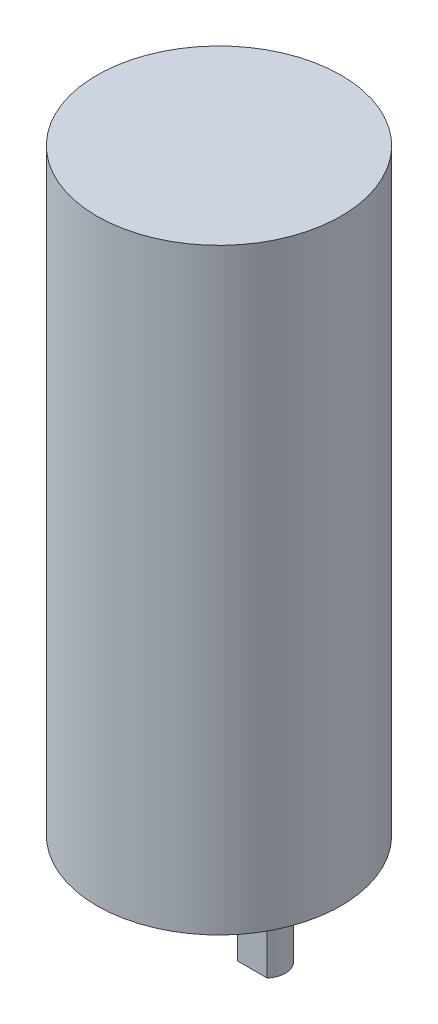
ISO-10303-21;
HEADER;
FILE_DESCRIPTION(('STEP AP214'),'2;1');
FILE_NAME('part.step','',(''),(''),'','','');
FILE_SCHEMA(('AUTOMOTIVE_DESIGN { 1 0 10303 214 1 1 1 1 }'));
ENDSEC;
DATA;
#1=APPLICATION_CONTEXT('core data for automotive mechanical design processes');
#2=APPLICATION_PROTOCOL_DEFINITION('international standard','automotive_design',2000,#1);
#3=PRODUCT_CONTEXT('',#1,'mechanical');
#4=PRODUCT('Part','Part','',(#3));
#5=PRODUCT_RELATED_PRODUCT_CATEGORY('part','',(#4));
#6=PRODUCT_DEFINITION_FORMATION('','',#4);
#7=PRODUCT_DEFINITION_CONTEXT('part definition',#1,'design');
#8=PRODUCT_DEFINITION('design','',#6,#7);
#9=PRODUCT_DEFINITION_SHAPE('','',#8);
#10=(LENGTH_UNIT() NAMED_UNIT(*) SI_UNIT(.MILLI.,.METRE.));
#11=(NAMED_UNIT(*) PLANE_ANGLE_UNIT() SI_UNIT($,.RADIAN.));
#12=(NAMED_UNIT(*) SI_UNIT($,.STERADIAN.) SOLID_ANGLE_UNIT());
#13=UNCERTAINTY_MEASURE_WITH_UNIT(LENGTH_MEASURE(1.E-05),#10,'distance_accuracy_value','');
#14=(GEOMETRIC_REPRESENTATION_CONTEXT(3) GLOBAL_UNCERTAINTY_ASSIGNED_CONTEXT((#13)) GLOBAL_UNIT_ASSIGNED_CONTEXT((#10,
#11,#12)) REPRESENTATION_CONTEXT('',''));
#15=CARTESIAN_POINT('',(0.,0.,0.));
#16=DIRECTION('',(0.,0.,1.));
#17=DIRECTION('',(1.,0.,0.));
#18=AXIS2_PLACEMENT_3D('',#15,#16,#17);
#19=CARTESIAN_POINT('',(0.,90.,0.));
#20=DIRECTION('',(0.,-1.,0.));
#21=DIRECTION('',(0.,0.,-1.));
#22=AXIS2_PLACEMENT_3D('',#19,#20,#21);
#23=CYLINDRICAL_SURFACE('',#22,18.4);
#24=CARTESIAN_POINT('',(0.,90.,0.));
#25=DIRECTION('',(0.,1.,0.));
#26=DIRECTION('',(0.,0.,1.));
#27=AXIS2_PLACEMENT_3D('',#24,#25,#26);
#28=CIRCLE('',#27,18.4);
#29=CARTESIAN_POINT('',(0.,90.,-18.4));
#30=VERTEX_POINT('',#29);
#31=EDGE_CURVE('E205',#30,#30,#28,.T.);
#32=CARTESIAN_POINT('',(0.,0.,0.));
#33=DIRECTION('',(0.,1.,0.));
#34=DIRECTION('',(0.,0.,1.));
#35=AXIS2_PLACEMENT_3D('',#32,#33,#34);
#36=CIRCLE('',#35,18.4);
#37=CARTESIAN_POINT('',(0.,0.,-18.4));
#38=VERTEX_POINT('',#37);
#39=EDGE_CURVE('E204',#38,#38,#36,.T.);
#40=CARTESIAN_POINT('',(0.,90.,-18.4));
#41=CARTESIAN_POINT('',(0.,89.0625,-18.4));
#42=CARTESIAN_POINT('',(0.,88.125,-18.4));
#43=CARTESIAN_POINT('',(0.,86.25,-18.4));
#44=CARTESIAN_POINT('',(0.,85.3125,-18.4));
#45=CARTESIAN_POINT('',(0.,83.4375,-18.4));
#46=CARTESIAN_POINT('',(0.,82.5,-18.4));
#47=CARTESIAN_POINT('',(0.,80.625,-18.4));
#48=CARTESIAN_POINT('',(0.,79.6875,-18.4));
#49=CARTESIAN_POINT('',(0.,77.8125,-18.4));
#50=CARTESIAN_POINT('',(0.,76.875,-18.4));
#51=CARTESIAN_POINT('',(0.,75.,-18.4));
#52=CARTESIAN_POINT('',(0.,74.0625,-18.4));
#53=CARTESIAN_POINT('',(0.,72.1875,-18.4));
#54=CARTESIAN_POINT('',(0.,71.25,-18.4));
#55=CARTESIAN_POINT('',(0.,69.375,-18.4));
#56=CARTESIAN_POINT('',(0.,68.4375,-18.4));
#57=CARTESIAN_POINT('',(0.,66.5625,-18.4));
#58=CARTESIAN_POINT('',(0.,65.625,-18.4));
#59=CARTESIAN_POINT('',(0.,63.75,-18.4));
#60=CARTESIAN_POINT('',(0.,62.8125,-18.4));
#61=CARTESIAN_POINT('',(0.,60.9375,-18.4));
#62=CARTESIAN_POINT('',(0.,60.,-18.4));
#63=CARTESIAN_POINT('',(0.,58.125,-18.4));
#64=CARTESIAN_POINT('',(0.,57.1875,-18.4));
#65=CARTESIAN_POINT('',(0.,55.3125,-18.4));
#66=CARTESIAN_POINT('',(0.,54.375,-18.4));
#67=CARTESIAN_POINT('',(0.,52.5,-18.4));
#68=CARTESIAN_POINT('',(0.,51.5625,-18.4));
#69=CARTESIAN_POINT('',(0.,49.6875,-18.4));
#70=CARTESIAN_POINT('',(0.,48.75,-18.4));
#71=CARTESIAN_POINT('',(0.,46.875,-18.4));
#72=CARTESIAN_POINT('',(0.,45.9375,-18.4));
#73=CARTESIAN_POINT('',(0.,44.0625,-18.4));
#74=CARTESIAN_POINT('',(0.,43.125,-18.4));
#75=CARTESIAN_POINT('',(0.,41.25,-18.4));
#76=CARTESIAN_POINT('',(0.,40.3125,-18.4));
#77=CARTESIAN_POINT('',(0.,38.4375,-18.4));
#78=CARTESIAN_POINT('',(0.,37.5,-18.4));
#79=CARTESIAN_POINT('',(0.,35.625,-18.4));
#80=CARTESIAN_POINT('',(0.,34.6875,-18.4));
#81=CARTESIAN_POINT('',(0.,32.8125,-18.4));
#82=CARTESIAN_POINT('',(0.,31.875,-18.4));
#83=CARTESIAN_POINT('',(0.,30.,-18.4));
#84=CARTESIAN_POINT('',(0.,29.0625,-18.4));
#85=CARTESIAN_POINT('',(0.,27.1875,-18.4));
#86=CARTESIAN_POINT('',(0.,26.25,-18.4));
#87=CARTESIAN_POINT('',(0.,24.375,-18.4));
#88=CARTESIAN_POINT('',(0.,23.4375,-18.4));
#89=CARTESIAN_POINT('',(0.,21.5625,-18.4));
#90=CARTESIAN_POINT('',(0.,20.625,-18.4));
#91=CARTESIAN_POINT('',(0.,18.75,-18.4));
#92=CARTESIAN_POINT('',(0.,17.8125,-18.4));
#93=CARTESIAN_POINT('',(0.,15.9375,-18.4));
#94=CARTESIAN_POINT('',(0.,15.,-18.4));
#95=CARTESIAN_POINT('',(0.,13.125,-18.4));
#96=CARTESIAN_POINT('',(0.,12.1875,-18.4));
#97=CARTESIAN_POINT('',(0.,10.3125,-18.4));
#98=CARTESIAN_POINT('',(0.,9.37499999999999,-18.4));
#99=CARTESIAN_POINT('',(0.,7.49999999999999,-18.4));
#100=CARTESIAN_POINT('',(0.,6.56249999999999,-18.4));
#101=CARTESIAN_POINT('',(0.,4.68749999999999,-18.4));
#102=CARTESIAN_POINT('',(0.,3.74999999999998,-18.4));
#103=CARTESIAN_POINT('',(0.,1.87499999999998,-18.4));
#104=CARTESIAN_POINT('',(0.,0.937499999999986,-18.4));
#105=CARTESIAN_POINT('',(0.,0.,-18.4));
#106=B_SPLINE_CURVE_WITH_KNOTS('',3,(#40,#41,#42,#43,#44,#45,#46,#47,#48,#49,#50,#51,#52,#53,
#54,#55,#56,#57,#58,#59,#60,#61,#62,#63,#64,#65,#66,#67,#68,#69,#70,#71,#72,#73,#74,#75,#76,#77,
#78,#79,#80,#81,#82,#83,#84,#85,#86,#87,#88,#89,#90,#91,#92,#93,#94,#95,#96,#97,#98,#99,#100,
#101,#102,#103,#104,#105),.UNSPECIFIED.,.F.,.F.,(4,2,2,2,2,2,2,2,2,2,2,2,2,2,2,2,2,2,2,2,2,2,2,
2,2,2,2,2,2,2,2,2,4),(0.,2.8125,5.62499999999999,8.43749999999999,11.25,14.0625,16.875,19.6875,
22.5,25.3125,28.125,30.9375,33.75,36.5625,39.375,42.1875,45.,47.8125,50.625,53.4375,56.25,
59.0625,61.875,64.6875,67.5,70.3125,73.125,75.9375,78.75,81.5625,84.375,87.1875,90.),.UNSPECIFIED.);
#107=EDGE_CURVE('BSEAM38',#30,#38,#106,.T.);
#108=ORIENTED_EDGE('',*,*,#31,.F.);
#109=ORIENTED_EDGE('',*,*,#39,.T.);
#110=ORIENTED_EDGE('',*,*,#107,.T.);
#111=ORIENTED_EDGE('',*,*,#107,.F.);
#112=EDGE_LOOP('',(#108,#110,#109,#111));
#113=FACE_BOUND('',#112,.T.);
#114=ADVANCED_FACE('F38',(#113),#23,.T.);
#115=CARTESIAN_POINT('',(0.,90.,0.));
#116=DIRECTION('',(0.,1.,0.));
#117=DIRECTION('',(0.,0.,1.));
#118=AXIS2_PLACEMENT_3D('',#115,#116,#117);
#119=PLANE('',#118);
#120=ORIENTED_EDGE('',*,*,#31,.T.);
#121=EDGE_LOOP('',(#120));
#122=FACE_BOUND('',#121,.T.);
#123=ADVANCED_FACE('F220',(#122),#119,.T.);
#124=CARTESIAN_POINT('',(0.,0.,0.));
#125=DIRECTION('',(0.,1.,0.));
#126=DIRECTION('',(0.,0.,1.));
#127=AXIS2_PLACEMENT_3D('',#124,#125,#126);
#128=PLANE('',#127);
#129=CARTESIAN_POINT('',(0.,0.,0.));
#130=DIRECTION('',(0.,-1.,0.));
#131=DIRECTION('',(0.,0.,-1.));
#132=AXIS2_PLACEMENT_3D('',#129,#130,#131);
#133=CIRCLE('',#132,13.);
#134=CARTESIAN_POINT('',(8.48114661311411,0.,-9.85241859275493));
#135=VERTEX_POINT('',#134);
#136=CARTESIAN_POINT('',(-8.48114661311411,0.,-9.85241859275493));
#137=VERTEX_POINT('',#136);
#138=EDGE_CURVE('E117',#135,#137,#133,.T.);
#139=ORIENTED_EDGE('',*,*,#138,.F.);
#140=CARTESIAN_POINT('',(0.,0.,-7.));
#141=DIRECTION('',(0.,1.,0.));
#142=DIRECTION('',(0.,0.,-1.));
#143=AXIS2_PLACEMENT_3D('',#140,#141,#142);
#144=CIRCLE('',#143,8.94796846783844);
#145=EDGE_CURVE('E59',#137,#135,#144,.T.);
#146=ORIENTED_EDGE('',*,*,#145,.F.);
#147=EDGE_LOOP('',(#139,#146));
#148=FACE_BOUND('',#147,.T.);
#149=CARTESIAN_POINT('',(0.,0.,-7.));
#150=DIRECTION('',(0.,1.,0.));
#151=DIRECTION('',(0.,0.,1.));
#152=AXIS2_PLACEMENT_3D('',#149,#150,#151);
#153=CIRCLE('',#152,6.);
#154=CARTESIAN_POINT('',(0.,0.,-0.999999999999999));
#155=VERTEX_POINT('',#154);
#156=EDGE_CURVE('E45',#155,#155,#153,.F.);
#157=ORIENTED_EDGE('',*,*,#156,.F.);
#158=EDGE_LOOP('',(#157));
#159=FACE_BOUND('',#158,.T.);
#160=CARTESIAN_POINT('',(7.75000000000007,0.,13.4233937586588));
#161=DIRECTION('',(0.,-1.,0.));
#162=DIRECTION('',(0.,0.,-1.));
#163=AXIS2_PLACEMENT_3D('',#160,#161,#162);
#164=CIRCLE('',#163,1.5);
#165=CARTESIAN_POINT('',(7.75000000000007,0.,11.9233937586588));
#166=VERTEX_POINT('',#165);
#167=EDGE_CURVE('E131',#166,#166,#164,.T.);
#168=ORIENTED_EDGE('',*,*,#167,.F.);
#169=EDGE_LOOP('',(#168));
#170=FACE_BOUND('',#169,.T.);
#171=CARTESIAN_POINT('',(15.5,0.,0.));
#172=DIRECTION('',(0.,-1.,0.));
#173=DIRECTION('',(0.,0.,-1.));
#174=AXIS2_PLACEMENT_3D('',#171,#172,#173);
#175=CIRCLE('',#174,1.5);
#176=CARTESIAN_POINT('',(15.5,0.,-1.50000000000001));
#177=VERTEX_POINT('',#176);
#178=EDGE_CURVE('E143',#177,#177,#175,.T.);
#179=ORIENTED_EDGE('',*,*,#178,.F.);
#180=EDGE_LOOP('',(#179));
#181=FACE_BOUND('',#180,.T.);
#182=CARTESIAN_POINT('',(7.75000000000001,0.,-13.4233937586588));
#183=DIRECTION('',(0.,-1.,0.));
#184=DIRECTION('',(0.,0.,-1.));
#185=AXIS2_PLACEMENT_3D('',#182,#183,#184);
#186=CIRCLE('',#185,1.5);
#187=CARTESIAN_POINT('',(7.75000000000001,0.,-14.9233937586588));
#188=VERTEX_POINT('',#187);
#189=EDGE_CURVE('E155',#188,#188,#186,.T.);
#190=ORIENTED_EDGE('',*,*,#189,.F.);
#191=EDGE_LOOP('',(#190));
#192=FACE_BOUND('',#191,.T.);
#193=CARTESIAN_POINT('',(-7.74999999999999,0.,-13.4233937586588));
#194=DIRECTION('',(0.,-1.,0.));
#195=DIRECTION('',(0.,0.,-1.));
#196=AXIS2_PLACEMENT_3D('',#193,#194,#195);
#197=CIRCLE('',#196,1.5);
#198=CARTESIAN_POINT('',(-7.74999999999999,0.,-14.9233937586588));
#199=VERTEX_POINT('',#198);
#200=EDGE_CURVE('E167',#199,#199,#197,.T.);
#201=ORIENTED_EDGE('',*,*,#200,.F.);
#202=EDGE_LOOP('',(#201));
#203=FACE_BOUND('',#202,.T.);
#204=CARTESIAN_POINT('',(-15.5,0.,0.));
#205=DIRECTION('',(0.,-1.,0.));
#206=DIRECTION('',(0.,0.,-1.));
#207=AXIS2_PLACEMENT_3D('',#204,#205,#206);
#208=CIRCLE('',#207,1.5);
#209=CARTESIAN_POINT('',(-15.5,0.,-1.49999999999998));
#210=VERTEX_POINT('',#209);
#211=EDGE_CURVE('E179',#210,#210,#208,.T.);
#212=ORIENTED_EDGE('',*,*,#211,.F.);
#213=EDGE_LOOP('',(#212));
#214=FACE_BOUND('',#213,.T.);
#215=CARTESIAN_POINT('',(-7.75000000000001,0.,13.4233937586588));
#216=DIRECTION('',(0.,-1.,0.));
#217=DIRECTION('',(0.,0.,-1.));
#218=AXIS2_PLACEMENT_3D('',#215,#216,#217);
#219=CIRCLE('',#218,1.5);
#220=CARTESIAN_POINT('',(-7.75000000000001,0.,11.9233937586588));
#221=VERTEX_POINT('',#220);
#222=EDGE_CURVE('E191',#221,#221,#219,.T.);
#223=ORIENTED_EDGE('',*,*,#222,.F.);
#224=EDGE_LOOP('',(#223));
#225=FACE_BOUND('',#224,.T.);
#226=ORIENTED_EDGE('',*,*,#39,.F.);
#227=EDGE_LOOP('',(#226));
#228=FACE_BOUND('',#227,.T.);
#229=ADVANCED_FACE('F216',(#148,#159,#170,#181,#192,#203,#214,#225,#228),#128,.F.);
#230=CARTESIAN_POINT('',(-7.75000000000001,8.5,13.4233937586588));
#231=DIRECTION('',(0.,-1.,0.));
#232=DIRECTION('',(0.,0.,-1.));
#233=AXIS2_PLACEMENT_3D('',#230,#231,#232);
#234=CONICAL_SURFACE('',#233,1.25,1.02974425867665);
#235=CARTESIAN_POINT('',(-7.75000000000001,9.25107577378445,13.4233937586588));
#236=VERTEX_POINT('',#235);
#237=VERTEX_LOOP('',#236);
#238=FACE_BOUND('',#237,.T.);
#239=CARTESIAN_POINT('',(-7.75000000000001,8.5,13.4233937586588));
#240=DIRECTION('',(0.,-1.,0.));
#241=DIRECTION('',(0.,0.,-1.));
#242=AXIS2_PLACEMENT_3D('',#239,#240,#241);
#243=CIRCLE('',#242,1.25);
#244=CARTESIAN_POINT('',(-7.75000000000001,8.5,12.1733937586588));
#245=VERTEX_POINT('',#244);
#246=EDGE_CURVE('E200',#245,#245,#243,.T.);
#247=ORIENTED_EDGE('',*,*,#246,.T.);
#248=EDGE_LOOP('',(#247));
#249=FACE_BOUND('',#248,.T.);
#250=ADVANCED_FACE('F219',(#238,#249),#234,.F.);
#251=CARTESIAN_POINT('',(-7.75000000000001,0.,13.4233937586588));
#252=DIRECTION('',(0.,-1.,0.));
#253=DIRECTION('',(0.,0.,-1.));
#254=AXIS2_PLACEMENT_3D('',#251,#252,#253);
#255=CYLINDRICAL_SURFACE('',#254,1.25);
#256=ORIENTED_EDGE('',*,*,#246,.F.);
#257=EDGE_LOOP('',(#256));
#258=FACE_BOUND('',#257,.T.);
#259=CARTESIAN_POINT('',(-7.75000000000001,6.,13.4233937586588));
#260=DIRECTION('',(0.,-1.,0.));
#261=DIRECTION('',(0.,0.,-1.));
#262=AXIS2_PLACEMENT_3D('',#259,#260,#261);
#263=CIRCLE('',#262,1.25);
#264=CARTESIAN_POINT('',(-7.75000000000001,6.,12.1733937586588));
#265=VERTEX_POINT('',#264);
#266=EDGE_CURVE('E197',#265,#265,#263,.T.);
#267=ORIENTED_EDGE('',*,*,#266,.T.);
#268=EDGE_LOOP('',(#267));
#269=FACE_BOUND('',#268,.T.);
#270=ADVANCED_FACE('F257',(#258,#269),#255,.F.);
#271=CARTESIAN_POINT('',(-6.50000000000001,6.,13.4233937586588));
#272=DIRECTION('',(0.,1.,0.));
#273=DIRECTION('',(0.,0.,1.));
#274=AXIS2_PLACEMENT_3D('',#271,#272,#273);
#275=PLANE('',#274);
#276=ORIENTED_EDGE('',*,*,#266,.F.);
#277=EDGE_LOOP('',(#276));
#278=FACE_BOUND('',#277,.T.);
#279=CARTESIAN_POINT('',(-7.75000000000001,6.,13.4233937586588));
#280=DIRECTION('',(0.,-1.,0.));
#281=DIRECTION('',(0.,0.,-1.));
#282=AXIS2_PLACEMENT_3D('',#279,#280,#281);
#283=CIRCLE('',#282,1.5);
#284=CARTESIAN_POINT('',(-7.75000000000001,6.,11.9233937586588));
#285=VERTEX_POINT('',#284);
#286=EDGE_CURVE('E194',#285,#285,#283,.T.);
#287=ORIENTED_EDGE('',*,*,#286,.T.);
#288=EDGE_LOOP('',(#287));
#289=FACE_BOUND('',#288,.T.);
#290=ADVANCED_FACE('F261',(#278,#289),#275,.F.);
#291=CARTESIAN_POINT('',(-7.75000000000001,0.,13.4233937586588));
#292=DIRECTION('',(0.,-1.,0.));
#293=DIRECTION('',(0.,0.,-1.));
#294=AXIS2_PLACEMENT_3D('',#291,#292,#293);
#295=CYLINDRICAL_SURFACE('',#294,1.5);
#296=ORIENTED_EDGE('',*,*,#286,.F.);
#297=EDGE_LOOP('',(#296));
#298=FACE_BOUND('',#297,.T.);
#299=ORIENTED_EDGE('',*,*,#222,.T.);
#300=EDGE_LOOP('',(#299));
#301=FACE_BOUND('',#300,.T.);
#302=ADVANCED_FACE('F265',(#298,#301),#295,.F.);
#303=CARTESIAN_POINT('',(-15.5,8.5,0.));
#304=DIRECTION('',(0.,-1.,0.));
#305=DIRECTION('',(0.,0.,-1.));
#306=AXIS2_PLACEMENT_3D('',#303,#304,#305);
#307=CONICAL_SURFACE('',#306,1.25,1.02974425867665);
#308=CARTESIAN_POINT('',(-15.5,9.25107577378445,0.));
#309=VERTEX_POINT('',#308);
#310=VERTEX_LOOP('',#309);
#311=FACE_BOUND('',#310,.T.);
#312=CARTESIAN_POINT('',(-15.5,8.5,0.));
#313=DIRECTION('',(0.,-1.,0.));
#314=DIRECTION('',(0.,0.,-1.));
#315=AXIS2_PLACEMENT_3D('',#312,#313,#314);
#316=CIRCLE('',#315,1.25);
#317=CARTESIAN_POINT('',(-15.5,8.5,-1.24999999999998));
#318=VERTEX_POINT('',#317);
#319=EDGE_CURVE('E188',#318,#318,#316,.T.);
#320=ORIENTED_EDGE('',*,*,#319,.T.);
#321=EDGE_LOOP('',(#320));
#322=FACE_BOUND('',#321,.T.);
#323=ADVANCED_FACE('F269',(#311,#322),#307,.F.);
#324=CARTESIAN_POINT('',(-15.5,0.,0.));
#325=DIRECTION('',(0.,-1.,0.));
#326=DIRECTION('',(0.,0.,-1.));
#327=AXIS2_PLACEMENT_3D('',#324,#325,#326);
#328=CYLINDRICAL_SURFACE('',#327,1.25);
#329=ORIENTED_EDGE('',*,*,#319,.F.);
#330=EDGE_LOOP('',(#329));
#331=FACE_BOUND('',#330,.T.);
#332=CARTESIAN_POINT('',(-15.5,6.,0.));
#333=DIRECTION('',(0.,-1.,0.));
#334=DIRECTION('',(0.,0.,-1.));
#335=AXIS2_PLACEMENT_3D('',#332,#333,#334);
#336=CIRCLE('',#335,1.25);
#337=CARTESIAN_POINT('',(-15.5,6.,-1.24999999999998));
#338=VERTEX_POINT('',#337);
#339=EDGE_CURVE('E185',#338,#338,#336,.T.);
#340=ORIENTED_EDGE('',*,*,#339,.T.);
#341=EDGE_LOOP('',(#340));
#342=FACE_BOUND('',#341,.T.);
#343=ADVANCED_FACE('F273',(#331,#342),#328,.F.);
#344=CARTESIAN_POINT('',(-14.25,6.,0.));
#345=DIRECTION('',(0.,1.,0.));
#346=DIRECTION('',(0.,0.,1.));
#347=AXIS2_PLACEMENT_3D('',#344,#345,#346);
#348=PLANE('',#347);
#349=ORIENTED_EDGE('',*,*,#339,.F.);
#350=EDGE_LOOP('',(#349));
#351=FACE_BOUND('',#350,.T.);
#352=CARTESIAN_POINT('',(-15.5,6.,0.));
#353=DIRECTION('',(0.,-1.,0.));
#354=DIRECTION('',(0.,0.,-1.));
#355=AXIS2_PLACEMENT_3D('',#352,#353,#354);
#356=CIRCLE('',#355,1.5);
#357=CARTESIAN_POINT('',(-15.5,6.,-1.49999999999998));
#358=VERTEX_POINT('',#357);
#359=EDGE_CURVE('E182',#358,#358,#356,.T.);
#360=ORIENTED_EDGE('',*,*,#359,.T.);
#361=EDGE_LOOP('',(#360));
#362=FACE_BOUND('',#361,.T.);
#363=ADVANCED_FACE('F277',(#351,#362),#348,.F.);
#364=CARTESIAN_POINT('',(-15.5,0.,0.));
#365=DIRECTION('',(0.,-1.,0.));
#366=DIRECTION('',(0.,0.,-1.));
#367=AXIS2_PLACEMENT_3D('',#364,#365,#366);
#368=CYLINDRICAL_SURFACE('',#367,1.5);
#369=ORIENTED_EDGE('',*,*,#359,.F.);
#370=EDGE_LOOP('',(#369));
#371=FACE_BOUND('',#370,.T.);
#372=ORIENTED_EDGE('',*,*,#211,.T.);
#373=EDGE_LOOP('',(#372));
#374=FACE_BOUND('',#373,.T.);
#375=ADVANCED_FACE('F281',(#371,#374),#368,.F.);
#376=CARTESIAN_POINT('',(-7.74999999999999,8.5,-13.4233937586588));
#377=DIRECTION('',(0.,-1.,0.));
#378=DIRECTION('',(0.,0.,-1.));
#379=AXIS2_PLACEMENT_3D('',#376,#377,#378);
#380=CONICAL_SURFACE('',#379,1.25,1.02974425867665);
#381=CARTESIAN_POINT('',(-7.74999999999999,9.25107577378445,-13.4233937586588));
#382=VERTEX_POINT('',#381);
#383=VERTEX_LOOP('',#382);
#384=FACE_BOUND('',#383,.T.);
#385=CARTESIAN_POINT('',(-7.74999999999999,8.5,-13.4233937586588));
#386=DIRECTION('',(0.,-1.,0.));
#387=DIRECTION('',(0.,0.,-1.));
#388=AXIS2_PLACEMENT_3D('',#385,#386,#387);
#389=CIRCLE('',#388,1.25);
#390=CARTESIAN_POINT('',(-7.74999999999999,8.5,-14.6733937586588));
#391=VERTEX_POINT('',#390);
#392=EDGE_CURVE('E176',#391,#391,#389,.T.);
#393=ORIENTED_EDGE('',*,*,#392,.T.);
#394=EDGE_LOOP('',(#393));
#395=FACE_BOUND('',#394,.T.);
#396=ADVANCED_FACE('F285',(#384,#395),#380,.F.);
#397=CARTESIAN_POINT('',(-7.74999999999999,0.,-13.4233937586588));
#398=DIRECTION('',(0.,-1.,0.));
#399=DIRECTION('',(0.,0.,-1.));
#400=AXIS2_PLACEMENT_3D('',#397,#398,#399);
#401=CYLINDRICAL_SURFACE('',#400,1.25);
#402=ORIENTED_EDGE('',*,*,#392,.F.);
#403=EDGE_LOOP('',(#402));
#404=FACE_BOUND('',#403,.T.);
#405=CARTESIAN_POINT('',(-7.74999999999999,6.,-13.4233937586588));
#406=DIRECTION('',(0.,-1.,0.));
#407=DIRECTION('',(0.,0.,-1.));
#408=AXIS2_PLACEMENT_3D('',#405,#406,#407);
#409=CIRCLE('',#408,1.25);
#410=CARTESIAN_POINT('',(-7.74999999999999,6.,-14.6733937586588));
#411=VERTEX_POINT('',#410);
#412=EDGE_CURVE('E173',#411,#411,#409,.T.);
#413=ORIENTED_EDGE('',*,*,#412,.T.);
#414=EDGE_LOOP('',(#413));
#415=FACE_BOUND('',#414,.T.);
#416=ADVANCED_FACE('F289',(#404,#415),#401,.F.);
#417=CARTESIAN_POINT('',(-6.49999999999999,6.,-13.4233937586588));
#418=DIRECTION('',(0.,1.,0.));
#419=DIRECTION('',(0.,0.,1.));
#420=AXIS2_PLACEMENT_3D('',#417,#418,#419);
#421=PLANE('',#420);
#422=ORIENTED_EDGE('',*,*,#412,.F.);
#423=EDGE_LOOP('',(#422));
#424=FACE_BOUND('',#423,.T.);
#425=CARTESIAN_POINT('',(-7.74999999999999,6.,-13.4233937586588));
#426=DIRECTION('',(0.,-1.,0.));
#427=DIRECTION('',(0.,0.,-1.));
#428=AXIS2_PLACEMENT_3D('',#425,#426,#427);
#429=CIRCLE('',#428,1.5);
#430=CARTESIAN_POINT('',(-7.74999999999999,6.,-14.9233937586588));
#431=VERTEX_POINT('',#430);
#432=EDGE_CURVE('E170',#431,#431,#429,.T.);
#433=ORIENTED_EDGE('',*,*,#432,.T.);
#434=EDGE_LOOP('',(#433));
#435=FACE_BOUND('',#434,.T.);
#436=ADVANCED_FACE('F293',(#424,#435),#421,.F.);
#437=CARTESIAN_POINT('',(-7.74999999999999,0.,-13.4233937586588));
#438=DIRECTION('',(0.,-1.,0.));
#439=DIRECTION('',(0.,0.,-1.));
#440=AXIS2_PLACEMENT_3D('',#437,#438,#439);
#441=CYLINDRICAL_SURFACE('',#440,1.5);
#442=ORIENTED_EDGE('',*,*,#432,.F.);
#443=EDGE_LOOP('',(#442));
#444=FACE_BOUND('',#443,.T.);
#445=ORIENTED_EDGE('',*,*,#200,.T.);
#446=EDGE_LOOP('',(#445));
#447=FACE_BOUND('',#446,.T.);
#448=ADVANCED_FACE('F297',(#444,#447),#441,.F.);
#449=CARTESIAN_POINT('',(7.75000000000001,8.5,-13.4233937586588));
#450=DIRECTION('',(0.,-1.,0.));
#451=DIRECTION('',(0.,0.,-1.));
#452=AXIS2_PLACEMENT_3D('',#449,#450,#451);
#453=CONICAL_SURFACE('',#452,1.25,1.02974425867665);
#454=CARTESIAN_POINT('',(7.75,9.25107577378445,-13.4233937586588));
#455=VERTEX_POINT('',#454);
#456=VERTEX_LOOP('',#455);
#457=FACE_BOUND('',#456,.T.);
#458=CARTESIAN_POINT('',(7.75000000000001,8.5,-13.4233937586588));
#459=DIRECTION('',(0.,-1.,0.));
#460=DIRECTION('',(0.,0.,-1.));
#461=AXIS2_PLACEMENT_3D('',#458,#459,#460);
#462=CIRCLE('',#461,1.25);
#463=CARTESIAN_POINT('',(7.75000000000001,8.5,-14.6733937586588));
#464=VERTEX_POINT('',#463);
#465=EDGE_CURVE('E164',#464,#464,#462,.T.);
#466=ORIENTED_EDGE('',*,*,#465,.T.);
#467=EDGE_LOOP('',(#466));
#468=FACE_BOUND('',#467,.T.);
#469=ADVANCED_FACE('F301',(#457,#468),#453,.F.);
#470=CARTESIAN_POINT('',(7.75000000000001,0.,-13.4233937586588));
#471=DIRECTION('',(0.,-1.,0.));
#472=DIRECTION('',(0.,0.,-1.));
#473=AXIS2_PLACEMENT_3D('',#470,#471,#472);
#474=CYLINDRICAL_SURFACE('',#473,1.25);
#475=ORIENTED_EDGE('',*,*,#465,.F.);
#476=EDGE_LOOP('',(#475));
#477=FACE_BOUND('',#476,.T.);
#478=CARTESIAN_POINT('',(7.75000000000001,6.,-13.4233937586588));
#479=DIRECTION('',(0.,-1.,0.));
#480=DIRECTION('',(0.,0.,-1.));
#481=AXIS2_PLACEMENT_3D('',#478,#479,#480);
#482=CIRCLE('',#481,1.25);
#483=CARTESIAN_POINT('',(7.75000000000001,6.,-14.6733937586588));
#484=VERTEX_POINT('',#483);
#485=EDGE_CURVE('E161',#484,#484,#482,.T.);
#486=ORIENTED_EDGE('',*,*,#485,.T.);
#487=EDGE_LOOP('',(#486));
#488=FACE_BOUND('',#487,.T.);
#489=ADVANCED_FACE('F305',(#477,#488),#474,.F.);
#490=CARTESIAN_POINT('',(9.00000000000001,6.,-13.4233937586588));
#491=DIRECTION('',(0.,1.,0.));
#492=DIRECTION('',(0.,0.,1.));
#493=AXIS2_PLACEMENT_3D('',#490,#491,#492);
#494=PLANE('',#493);
#495=ORIENTED_EDGE('',*,*,#485,.F.);
#496=EDGE_LOOP('',(#495));
#497=FACE_BOUND('',#496,.T.);
#498=CARTESIAN_POINT('',(7.75000000000001,6.,-13.4233937586588));
#499=DIRECTION('',(0.,-1.,0.));
#500=DIRECTION('',(0.,0.,-1.));
#501=AXIS2_PLACEMENT_3D('',#498,#499,#500);
#502=CIRCLE('',#501,1.5);
#503=CARTESIAN_POINT('',(7.75000000000001,6.,-14.9233937586588));
#504=VERTEX_POINT('',#503);
#505=EDGE_CURVE('E158',#504,#504,#502,.T.);
#506=ORIENTED_EDGE('',*,*,#505,.T.);
#507=EDGE_LOOP('',(#506));
#508=FACE_BOUND('',#507,.T.);
#509=ADVANCED_FACE('F309',(#497,#508),#494,.F.);
#510=CARTESIAN_POINT('',(7.75000000000001,0.,-13.4233937586588));
#511=DIRECTION('',(0.,-1.,0.));
#512=DIRECTION('',(0.,0.,-1.));
#513=AXIS2_PLACEMENT_3D('',#510,#511,#512);
#514=CYLINDRICAL_SURFACE('',#513,1.5);
#515=ORIENTED_EDGE('',*,*,#505,.F.);
#516=EDGE_LOOP('',(#515));
#517=FACE_BOUND('',#516,.T.);
#518=ORIENTED_EDGE('',*,*,#189,.T.);
#519=EDGE_LOOP('',(#518));
#520=FACE_BOUND('',#519,.T.);
#521=ADVANCED_FACE('F313',(#517,#520),#514,.F.);
#522=CARTESIAN_POINT('',(15.5,8.5,0.));
#523=DIRECTION('',(0.,-1.,0.));
#524=DIRECTION('',(0.,0.,-1.));
#525=AXIS2_PLACEMENT_3D('',#522,#523,#524);
#526=CONICAL_SURFACE('',#525,1.25,1.02974425867665);
#527=CARTESIAN_POINT('',(15.5,9.25107577378445,0.));
#528=VERTEX_POINT('',#527);
#529=VERTEX_LOOP('',#528);
#530=FACE_BOUND('',#529,.T.);
#531=CARTESIAN_POINT('',(15.5,8.5,0.));
#532=DIRECTION('',(0.,-1.,0.));
#533=DIRECTION('',(0.,0.,-1.));
#534=AXIS2_PLACEMENT_3D('',#531,#532,#533);
#535=CIRCLE('',#534,1.25);
#536=CARTESIAN_POINT('',(15.5,8.5,-1.25000000000001));
#537=VERTEX_POINT('',#536);
#538=EDGE_CURVE('E152',#537,#537,#535,.T.);
#539=ORIENTED_EDGE('',*,*,#538,.T.);
#540=EDGE_LOOP('',(#539));
#541=FACE_BOUND('',#540,.T.);
#542=ADVANCED_FACE('F317',(#530,#541),#526,.F.);
#543=CARTESIAN_POINT('',(15.5,0.,0.));
#544=DIRECTION('',(0.,-1.,0.));
#545=DIRECTION('',(0.,0.,-1.));
#546=AXIS2_PLACEMENT_3D('',#543,#544,#545);
#547=CYLINDRICAL_SURFACE('',#546,1.25);
#548=ORIENTED_EDGE('',*,*,#538,.F.);
#549=EDGE_LOOP('',(#548));
#550=FACE_BOUND('',#549,.T.);
#551=CARTESIAN_POINT('',(15.5,6.,0.));
#552=DIRECTION('',(0.,-1.,0.));
#553=DIRECTION('',(0.,0.,-1.));
#554=AXIS2_PLACEMENT_3D('',#551,#552,#553);
#555=CIRCLE('',#554,1.25);
#556=CARTESIAN_POINT('',(15.5,6.,-1.25000000000001));
#557=VERTEX_POINT('',#556);
#558=EDGE_CURVE('E149',#557,#557,#555,.T.);
#559=ORIENTED_EDGE('',*,*,#558,.T.);
#560=EDGE_LOOP('',(#559));
#561=FACE_BOUND('',#560,.T.);
#562=ADVANCED_FACE('F321',(#550,#561),#547,.F.);
#563=CARTESIAN_POINT('',(16.75,6.,0.));
#564=DIRECTION('',(0.,1.,0.));
#565=DIRECTION('',(0.,0.,1.));
#566=AXIS2_PLACEMENT_3D('',#563,#564,#565);
#567=PLANE('',#566);
#568=ORIENTED_EDGE('',*,*,#558,.F.);
#569=EDGE_LOOP('',(#568));
#570=FACE_BOUND('',#569,.T.);
#571=CARTESIAN_POINT('',(15.5,6.,0.));
#572=DIRECTION('',(0.,-1.,0.));
#573=DIRECTION('',(0.,0.,-1.));
#574=AXIS2_PLACEMENT_3D('',#571,#572,#573);
#575=CIRCLE('',#574,1.5);
#576=CARTESIAN_POINT('',(15.5,6.,-1.50000000000001));
#577=VERTEX_POINT('',#576);
#578=EDGE_CURVE('E146',#577,#577,#575,.T.);
#579=ORIENTED_EDGE('',*,*,#578,.T.);
#580=EDGE_LOOP('',(#579));
#581=FACE_BOUND('',#580,.T.);
#582=ADVANCED_FACE('F325',(#570,#581),#567,.F.);
#583=CARTESIAN_POINT('',(15.5,0.,0.));
#584=DIRECTION('',(0.,-1.,0.));
#585=DIRECTION('',(0.,0.,-1.));
#586=AXIS2_PLACEMENT_3D('',#583,#584,#585);
#587=CYLINDRICAL_SURFACE('',#586,1.5);
#588=ORIENTED_EDGE('',*,*,#578,.F.);
#589=EDGE_LOOP('',(#588));
#590=FACE_BOUND('',#589,.T.);
#591=ORIENTED_EDGE('',*,*,#178,.T.);
#592=EDGE_LOOP('',(#591));
#593=FACE_BOUND('',#592,.T.);
#594=ADVANCED_FACE('F329',(#590,#593),#587,.F.);
#595=CARTESIAN_POINT('',(7.75000000000007,8.5,13.4233937586588));
#596=DIRECTION('',(0.,-1.,0.));
#597=DIRECTION('',(0.,0.,-1.));
#598=AXIS2_PLACEMENT_3D('',#595,#596,#597);
#599=CONICAL_SURFACE('',#598,1.25,1.02974425867665);
#600=CARTESIAN_POINT('',(7.75000000000007,9.25107577378445,13.4233937586588));
#601=VERTEX_POINT('',#600);
#602=VERTEX_LOOP('',#601);
#603=FACE_BOUND('',#602,.T.);
#604=CARTESIAN_POINT('',(7.75000000000007,8.5,13.4233937586588));
#605=DIRECTION('',(0.,-1.,0.));
#606=DIRECTION('',(0.,0.,-1.));
#607=AXIS2_PLACEMENT_3D('',#604,#605,#606);
#608=CIRCLE('',#607,1.25);
#609=CARTESIAN_POINT('',(7.75000000000007,8.5,12.1733937586588));
#610=VERTEX_POINT('',#609);
#611=EDGE_CURVE('E140',#610,#610,#608,.T.);
#612=ORIENTED_EDGE('',*,*,#611,.T.);
#613=EDGE_LOOP('',(#612));
#614=FACE_BOUND('',#613,.T.);
#615=ADVANCED_FACE('F333',(#603,#614),#599,.F.);
#616=CARTESIAN_POINT('',(7.75000000000007,0.,13.4233937586588));
#617=DIRECTION('',(0.,-1.,0.));
#618=DIRECTION('',(0.,0.,-1.));
#619=AXIS2_PLACEMENT_3D('',#616,#617,#618);
#620=CYLINDRICAL_SURFACE('',#619,1.25);
#621=ORIENTED_EDGE('',*,*,#611,.F.);
#622=EDGE_LOOP('',(#621));
#623=FACE_BOUND('',#622,.T.);
#624=CARTESIAN_POINT('',(7.75000000000007,6.,13.4233937586588));
#625=DIRECTION('',(0.,-1.,0.));
#626=DIRECTION('',(0.,0.,-1.));
#627=AXIS2_PLACEMENT_3D('',#624,#625,#626);
#628=CIRCLE('',#627,1.25);
#629=CARTESIAN_POINT('',(7.75000000000007,6.,12.1733937586588));
#630=VERTEX_POINT('',#629);
#631=EDGE_CURVE('E137',#630,#630,#628,.T.);
#632=ORIENTED_EDGE('',*,*,#631,.T.);
#633=EDGE_LOOP('',(#632));
#634=FACE_BOUND('',#633,.T.);
#635=ADVANCED_FACE('F337',(#623,#634),#620,.F.);
#636=CARTESIAN_POINT('',(9.00000000000007,6.,13.4233937586588));
#637=DIRECTION('',(0.,1.,0.));
#638=DIRECTION('',(0.,0.,1.));
#639=AXIS2_PLACEMENT_3D('',#636,#637,#638);
#640=PLANE('',#639);
#641=ORIENTED_EDGE('',*,*,#631,.F.);
#642=EDGE_LOOP('',(#641));
#643=FACE_BOUND('',#642,.T.);
#644=CARTESIAN_POINT('',(7.75000000000007,6.,13.4233937586588));
#645=DIRECTION('',(0.,-1.,0.));
#646=DIRECTION('',(0.,0.,-1.));
#647=AXIS2_PLACEMENT_3D('',#644,#645,#646);
#648=CIRCLE('',#647,1.5);
#649=CARTESIAN_POINT('',(7.75000000000007,6.,11.9233937586588));
#650=VERTEX_POINT('',#649);
#651=EDGE_CURVE('E134',#650,#650,#648,.T.);
#652=ORIENTED_EDGE('',*,*,#651,.T.);
#653=EDGE_LOOP('',(#652));
#654=FACE_BOUND('',#653,.T.);
#655=ADVANCED_FACE('F341',(#643,#654),#640,.F.);
#656=CARTESIAN_POINT('',(7.75000000000007,0.,13.4233937586588));
#657=DIRECTION('',(0.,-1.,0.));
#658=DIRECTION('',(0.,0.,-1.));
#659=AXIS2_PLACEMENT_3D('',#656,#657,#658);
#660=CYLINDRICAL_SURFACE('',#659,1.5);
#661=ORIENTED_EDGE('',*,*,#651,.F.);
#662=EDGE_LOOP('',(#661));
#663=FACE_BOUND('',#662,.T.);
#664=ORIENTED_EDGE('',*,*,#167,.T.);
#665=EDGE_LOOP('',(#664));
#666=FACE_BOUND('',#665,.T.);
#667=ADVANCED_FACE('F345',(#663,#666),#660,.F.);
#668=CARTESIAN_POINT('',(0.,-6.5,-7.));
#669=DIRECTION('',(0.,1.,0.));
#670=DIRECTION('',(0.,0.,1.));
#671=AXIS2_PLACEMENT_3D('',#668,#669,#670);
#672=CYLINDRICAL_SURFACE('',#671,6.);
#673=CARTESIAN_POINT('',(0.,-6.5,-7.));
#674=DIRECTION('',(0.,-1.,0.));
#675=DIRECTION('',(0.,0.,-1.));
#676=AXIS2_PLACEMENT_3D('',#673,#674,#675);
#677=CIRCLE('',#676,6.);
#678=CARTESIAN_POINT('',(0.,-6.5,-0.999999999999999));
#679=VERTEX_POINT('',#678);
#680=EDGE_CURVE('E126',#679,#679,#677,.T.);
#681=CARTESIAN_POINT('',(0.,-6.5,-0.999999999999999));
#682=CARTESIAN_POINT('',(0.,-6.43229166666667,-0.999999999999999));
#683=CARTESIAN_POINT('',(0.,-6.36458333333333,-0.999999999999999));
#684=CARTESIAN_POINT('',(0.,-6.22916666666667,-0.999999999999999));
#685=CARTESIAN_POINT('',(0.,-6.16145833333333,-0.999999999999999));
#686=CARTESIAN_POINT('',(0.,-6.02604166666667,-0.999999999999999));
#687=CARTESIAN_POINT('',(0.,-5.95833333333333,-0.999999999999999));
#688=CARTESIAN_POINT('',(0.,-5.82291666666667,-0.999999999999999));
#689=CARTESIAN_POINT('',(0.,-5.75520833333333,-0.999999999999999));
#690=CARTESIAN_POINT('',(0.,-5.61979166666667,-0.999999999999999));
#691=CARTESIAN_POINT('',(0.,-5.55208333333333,-0.999999999999999));
#692=CARTESIAN_POINT('',(0.,-5.41666666666667,-0.999999999999999));
#693=CARTESIAN_POINT('',(0.,-5.34895833333333,-0.999999999999999));
#694=CARTESIAN_POINT('',(0.,-5.21354166666667,-0.999999999999999));
#695=CARTESIAN_POINT('',(0.,-5.14583333333333,-0.999999999999999));
#696=CARTESIAN_POINT('',(0.,-5.01041666666667,-0.999999999999999));
#697=CARTESIAN_POINT('',(0.,-4.94270833333333,-0.999999999999999));
#698=CARTESIAN_POINT('',(0.,-4.80729166666667,-0.999999999999999));
#699=CARTESIAN_POINT('',(0.,-4.73958333333333,-0.999999999999999));
#700=CARTESIAN_POINT('',(0.,-4.60416666666667,-0.999999999999999));
#701=CARTESIAN_POINT('',(0.,-4.53645833333333,-0.999999999999999));
#702=CARTESIAN_POINT('',(0.,-4.40104166666667,-0.999999999999999));
#703=CARTESIAN_POINT('',(0.,-4.33333333333333,-0.999999999999999));
#704=CARTESIAN_POINT('',(0.,-4.19791666666667,-0.999999999999999));
#705=CARTESIAN_POINT('',(0.,-4.13020833333333,-0.999999999999999));
#706=CARTESIAN_POINT('',(0.,-3.99479166666667,-0.999999999999999));
#707=CARTESIAN_POINT('',(0.,-3.92708333333333,-0.999999999999999));
#708=CARTESIAN_POINT('',(0.,-3.79166666666667,-0.999999999999999));
#709=CARTESIAN_POINT('',(0.,-3.72395833333333,-0.999999999999999));
#710=CARTESIAN_POINT('',(0.,-3.58854166666667,-0.999999999999999));
#711=CARTESIAN_POINT('',(0.,-3.52083333333333,-0.999999999999999));
#712=CARTESIAN_POINT('',(0.,-3.38541666666667,-0.999999999999999));
#713=CARTESIAN_POINT('',(0.,-3.31770833333333,-0.999999999999999));
#714=CARTESIAN_POINT('',(0.,-3.18229166666667,-0.999999999999999));
#715=CARTESIAN_POINT('',(0.,-3.11458333333333,-0.999999999999999));
#716=CARTESIAN_POINT('',(0.,-2.97916666666667,-0.999999999999999));
#717=CARTESIAN_POINT('',(0.,-2.91145833333333,-0.999999999999999));
#718=CARTESIAN_POINT('',(0.,-2.77604166666667,-0.999999999999999));
#719=CARTESIAN_POINT('',(0.,-2.70833333333333,-0.999999999999999));
#720=CARTESIAN_POINT('',(0.,-2.57291666666667,-0.999999999999999));
#721=CARTESIAN_POINT('',(0.,-2.50520833333333,-0.999999999999999));
#722=CARTESIAN_POINT('',(0.,-2.36979166666667,-0.999999999999999));
#723=CARTESIAN_POINT('',(0.,-2.30208333333333,-0.999999999999999));
#724=CARTESIAN_POINT('',(0.,-2.16666666666667,-0.999999999999999));
#725=CARTESIAN_POINT('',(0.,-2.09895833333333,-0.999999999999999));
#726=CARTESIAN_POINT('',(0.,-1.96354166666667,-0.999999999999999));
#727=CARTESIAN_POINT('',(0.,-1.89583333333333,-0.999999999999999));
#728=CARTESIAN_POINT('',(0.,-1.76041666666667,-0.999999999999999));
#729=CARTESIAN_POINT('',(0.,-1.69270833333333,-0.999999999999999));
#730=CARTESIAN_POINT('',(0.,-1.55729166666667,-0.999999999999999));
#731=CARTESIAN_POINT('',(0.,-1.48958333333333,-0.999999999999999));
#732=CARTESIAN_POINT('',(0.,-1.35416666666667,-0.999999999999999));
#733=CARTESIAN_POINT('',(0.,-1.28645833333333,-0.999999999999999));
#734=CARTESIAN_POINT('',(0.,-1.15104166666667,-0.999999999999999));
#735=CARTESIAN_POINT('',(0.,-1.08333333333333,-0.999999999999999));
#736=CARTESIAN_POINT('',(0.,-0.947916666666667,-0.999999999999999));
#737=CARTESIAN_POINT('',(0.,-0.880208333333333,-0.999999999999999));
#738=CARTESIAN_POINT('',(0.,-0.744791666666667,-0.999999999999999));
#739=CARTESIAN_POINT('',(0.,-0.677083333333333,-0.999999999999999));
#740=CARTESIAN_POINT('',(0.,-0.541666666666667,-0.999999999999999));
#741=CARTESIAN_POINT('',(0.,-0.473958333333333,-0.999999999999999));
#742=CARTESIAN_POINT('',(0.,-0.338541666666667,-0.999999999999999));
#743=CARTESIAN_POINT('',(0.,-0.270833333333334,-0.999999999999999));
#744=CARTESIAN_POINT('',(0.,-0.135416666666667,-0.999999999999999));
#745=CARTESIAN_POINT('',(0.,-0.0677083333333334,-0.999999999999999));
#746=CARTESIAN_POINT('',(0.,0.,-0.999999999999999));
#747=B_SPLINE_CURVE_WITH_KNOTS('',3,(#681,#682,#683,#684,#685,#686,#687,#688,#689,#690,#691,
#692,#693,#694,#695,#696,#697,#698,#699,#700,#701,#702,#703,#704,#705,#706,#707,#708,#709,#710,
#711,#712,#713,#714,#715,#716,#717,#718,#719,#720,#721,#722,#723,#724,#725,#726,#727,#728,#729,
#730,#731,#732,#733,#734,#735,#736,#737,#738,#739,#740,#741,#742,#743,#744,#745,#746),
.UNSPECIFIED.,.F.,.F.,(4,2,2,2,2,2,2,2,2,2,2,2,2,2,2,2,2,2,2,2,2,2,2,2,2,2,2,2,2,2,2,2,4),(0.,
0.203125,0.40625,0.609375000000001,0.812500000000001,1.015625,1.21875,1.421875,1.625,1.828125,
2.03125,2.234375,2.4375,2.640625,2.84375,3.046875,3.25,3.453125,3.65625,3.859375,4.0625,
4.265625,4.46875,4.671875,4.875,5.078125,5.28125,5.484375,5.6875,5.890625,6.09375,6.296875,6.5),.UNSPECIFIED.);
#748=EDGE_CURVE('BSEAM214',#679,#155,#747,.T.);
#749=ORIENTED_EDGE('',*,*,#680,.F.);
#750=ORIENTED_EDGE('',*,*,#156,.T.);
#751=ORIENTED_EDGE('',*,*,#748,.T.);
#752=ORIENTED_EDGE('',*,*,#748,.F.);
#753=EDGE_LOOP('',(#749,#751,#750,#752));
#754=FACE_BOUND('',#753,.T.);
#755=ADVANCED_FACE('F214',(#754),#672,.T.);
#756=CARTESIAN_POINT('',(0.,-6.5,-7.));
#757=DIRECTION('',(0.,-1.,0.));
#758=DIRECTION('',(0.,0.,-1.));
#759=AXIS2_PLACEMENT_3D('',#756,#757,#758);
#760=PLANE('',#759);
#761=CARTESIAN_POINT('',(0.,-6.5,-7.));
#762=DIRECTION('',(0.,-1.,0.));
#763=DIRECTION('',(0.,0.,-1.));
#764=AXIS2_PLACEMENT_3D('',#761,#762,#763);
#765=CIRCLE('',#764,3.);
#766=CARTESIAN_POINT('',(0.,-6.5,-10.));
#767=VERTEX_POINT('',#766);
#768=EDGE_CURVE('E130',#767,#767,#765,.T.);
#769=ORIENTED_EDGE('',*,*,#768,.F.);
#770=EDGE_LOOP('',(#769));
#771=FACE_BOUND('',#770,.T.);
#772=ORIENTED_EDGE('',*,*,#680,.T.);
#773=EDGE_LOOP('',(#772));
#774=FACE_BOUND('',#773,.T.);
#775=ADVANCED_FACE('F253',(#771,#774),#760,.T.);
#776=CARTESIAN_POINT('',(0.,-20.,-7.));
#777=DIRECTION('',(0.,-1.,0.));
#778=DIRECTION('',(0.,0.,-1.));
#779=AXIS2_PLACEMENT_3D('',#776,#777,#778);
#780=PLANE('',#779);
#781=DIRECTION('',(1.,0.,0.));
#782=VECTOR('',#781,1.);
#783=CARTESIAN_POINT('',(-2.23606797749979,-20.,-5.));
#784=LINE('',#783,#782);
#785=CARTESIAN_POINT('',(-2.23606797749979,-20.,-5.));
#786=VERTEX_POINT('',#785);
#787=CARTESIAN_POINT('',(2.23606797749979,-20.,-5.));
#788=VERTEX_POINT('',#787);
#789=EDGE_CURVE('E102',#786,#788,#784,.T.);
#790=ORIENTED_EDGE('',*,*,#789,.F.);
#791=CARTESIAN_POINT('',(0.,-20.,-7.));
#792=DIRECTION('',(0.,-1.,0.));
#793=DIRECTION('',(0.,0.,-1.));
#794=AXIS2_PLACEMENT_3D('',#791,#792,#793);
#795=CIRCLE('',#794,3.);
#796=EDGE_CURVE('E108',#786,#788,#795,.T.);
#797=ORIENTED_EDGE('',*,*,#796,.T.);
#798=EDGE_LOOP('',(#790,#797));
#799=FACE_BOUND('',#798,.T.);
#800=ADVANCED_FACE('F250',(#799),#780,.T.);
#801=CARTESIAN_POINT('',(0.,-20.,-7.));
#802=DIRECTION('',(0.,1.,0.));
#803=DIRECTION('',(0.,0.,1.));
#804=AXIS2_PLACEMENT_3D('',#801,#802,#803);
#805=CYLINDRICAL_SURFACE('',#804,3.);
#806=ORIENTED_EDGE('',*,*,#796,.F.);
#807=DIRECTION('',(0.,-1.,0.));
#808=VECTOR('',#807,1.);
#809=CARTESIAN_POINT('',(-2.23606797749979,-10.,-5.));
#810=LINE('',#809,#808);
#811=CARTESIAN_POINT('',(-2.23606797749979,-10.,-5.));
#812=VERTEX_POINT('',#811);
#813=EDGE_CURVE('E99',#812,#786,#810,.T.);
#814=ORIENTED_EDGE('',*,*,#813,.F.);
#815=CARTESIAN_POINT('',(0.,-10.,-7.));
#816=DIRECTION('',(0.,1.,0.));
#817=DIRECTION('',(0.,0.,1.));
#818=AXIS2_PLACEMENT_3D('',#815,#816,#817);
#819=CIRCLE('',#818,3.);
#820=CARTESIAN_POINT('',(2.23606797749979,-10.,-5.));
#821=VERTEX_POINT('',#820);
#822=EDGE_CURVE('E11',#812,#821,#819,.T.);
#823=ORIENTED_EDGE('',*,*,#822,.T.);
#824=DIRECTION('',(0.,-1.,0.));
#825=VECTOR('',#824,1.);
#826=CARTESIAN_POINT('',(2.23606797749979,-10.,-5.));
#827=LINE('',#826,#825);
#828=EDGE_CURVE('E101',#821,#788,#827,.T.);
#829=ORIENTED_EDGE('',*,*,#828,.T.);
#830=EDGE_LOOP('',(#806,#814,#823,#829));
#831=FACE_BOUND('',#830,.T.);
#832=ORIENTED_EDGE('',*,*,#768,.T.);
#833=EDGE_LOOP('',(#832));
#834=FACE_BOUND('',#833,.T.);
#835=ADVANCED_FACE('F105',(#831,#834),#805,.T.);
#836=CARTESIAN_POINT('',(0.,2.,-7.));
#837=DIRECTION('',(0.,-1.,0.));
#838=DIRECTION('',(0.,0.,-1.));
#839=AXIS2_PLACEMENT_3D('',#836,#837,#838);
#840=CYLINDRICAL_SURFACE('',#839,8.94796846783844);
#841=ORIENTED_EDGE('',*,*,#145,.T.);
#842=DIRECTION('',(0.,-1.,0.));
#843=VECTOR('',#842,1.);
#844=CARTESIAN_POINT('',(8.48114661311411,2.,-9.85241859275493));
#845=LINE('',#844,#843);
#846=CARTESIAN_POINT('',(8.48114661311411,2.,-9.85241859275493));
#847=VERTEX_POINT('',#846);
#848=EDGE_CURVE('E120',#847,#135,#845,.T.);
#849=ORIENTED_EDGE('',*,*,#848,.F.);
#850=CARTESIAN_POINT('',(0.,2.,-7.));
#851=DIRECTION('',(0.,1.,0.));
#852=DIRECTION('',(0.,0.,-1.));
#853=AXIS2_PLACEMENT_3D('',#850,#851,#852);
#854=CIRCLE('',#853,8.94796846783844);
#855=CARTESIAN_POINT('',(-8.48114661311411,2.,-9.85241859275493));
#856=VERTEX_POINT('',#855);
#857=EDGE_CURVE('E113',#856,#847,#854,.T.);
#858=ORIENTED_EDGE('',*,*,#857,.F.);
#859=DIRECTION('',(0.,-1.,0.));
#860=VECTOR('',#859,1.);
#861=CARTESIAN_POINT('',(-8.48114661311411,2.,-9.85241859275493));
#862=LINE('',#861,#860);
#863=EDGE_CURVE('E124',#856,#137,#862,.T.);
#864=ORIENTED_EDGE('',*,*,#863,.T.);
#865=EDGE_LOOP('',(#841,#849,#858,#864));
#866=FACE_BOUND('',#865,.T.);
#867=ADVANCED_FACE('F249',(#866),#840,.T.);
#868=CARTESIAN_POINT('',(0.,2.,0.));
#869=DIRECTION('',(0.,-1.,0.));
#870=DIRECTION('',(0.,0.,-1.));
#871=AXIS2_PLACEMENT_3D('',#868,#869,#870);
#872=CYLINDRICAL_SURFACE('',#871,13.);
#873=ORIENTED_EDGE('',*,*,#138,.T.);
#874=ORIENTED_EDGE('',*,*,#863,.F.);
#875=CARTESIAN_POINT('',(0.,2.,0.));
#876=DIRECTION('',(0.,-1.,0.));
#877=DIRECTION('',(0.,0.,-1.));
#878=AXIS2_PLACEMENT_3D('',#875,#876,#877);
#879=CIRCLE('',#878,13.);
#880=EDGE_CURVE('E116',#847,#856,#879,.T.);
#881=ORIENTED_EDGE('',*,*,#880,.F.);
#882=ORIENTED_EDGE('',*,*,#848,.T.);
#883=EDGE_LOOP('',(#873,#874,#881,#882));
#884=FACE_BOUND('',#883,.T.);
#885=ADVANCED_FACE('F358',(#884),#872,.F.);
#886=CARTESIAN_POINT('',(0.,2.,-3.5));
#887=DIRECTION('',(0.,-1.,0.));
#888=DIRECTION('',(0.,0.,-1.));
#889=AXIS2_PLACEMENT_3D('',#886,#887,#888);
#890=PLANE('',#889);
#891=ORIENTED_EDGE('',*,*,#857,.T.);
#892=ORIENTED_EDGE('',*,*,#880,.T.);
#893=EDGE_LOOP('',(#891,#892));
#894=FACE_BOUND('',#893,.T.);
#895=ADVANCED_FACE('F361',(#894),#890,.T.);
#896=CARTESIAN_POINT('',(0.,-10.,0.));
#897=DIRECTION('',(0.,1.,0.));
#898=DIRECTION('',(0.,0.,1.));
#899=AXIS2_PLACEMENT_3D('',#896,#897,#898);
#900=PLANE('',#899);
#901=DIRECTION('',(1.,0.,0.));
#902=VECTOR('',#901,1.);
#903=CARTESIAN_POINT('',(-2.23606797749979,-10.,-5.));
#904=LINE('',#903,#902);
#905=EDGE_CURVE('E51',#812,#821,#904,.T.);
#906=ORIENTED_EDGE('',*,*,#905,.T.);
#907=ORIENTED_EDGE('',*,*,#822,.F.);
#908=EDGE_LOOP('',(#906,#907));
#909=FACE_BOUND('',#908,.T.);
#910=ADVANCED_FACE('F93',(#909),#900,.F.);
#911=CARTESIAN_POINT('',(-2.23606797749979,-10.,-5.));
#912=DIRECTION('',(0.,0.,-1.));
#913=DIRECTION('',(-1.,0.,0.));
#914=AXIS2_PLACEMENT_3D('',#911,#912,#913);
#915=PLANE('',#914);
#916=ORIENTED_EDGE('',*,*,#789,.T.);
#917=ORIENTED_EDGE('',*,*,#828,.F.);
#918=ORIENTED_EDGE('',*,*,#905,.F.);
#919=ORIENTED_EDGE('',*,*,#813,.T.);
#920=EDGE_LOOP('',(#916,#917,#918,#919));
#921=FACE_BOUND('',#920,.T.);
#922=ADVANCED_FACE('F98',(#921),#915,.F.);
#923=CLOSED_SHELL('',(#114,#123,#229,#250,#270,#290,#302,#323,#343,#363,#375,#396,#416,#436,
#448,#469,#489,#509,#521,#542,#562,#582,#594,#615,#635,#655,#667,#755,#775,#800,#835,#867,#885,
#895,#910,#922));
#924=MANIFOLD_SOLID_BREP('B2',#923);
#925=ADVANCED_BREP_SHAPE_REPRESENTATION('',(#18,#924),#14);
#926=SHAPE_DEFINITION_REPRESENTATION(#9,#925);
ENDSEC;
END-ISO-10303-21;
